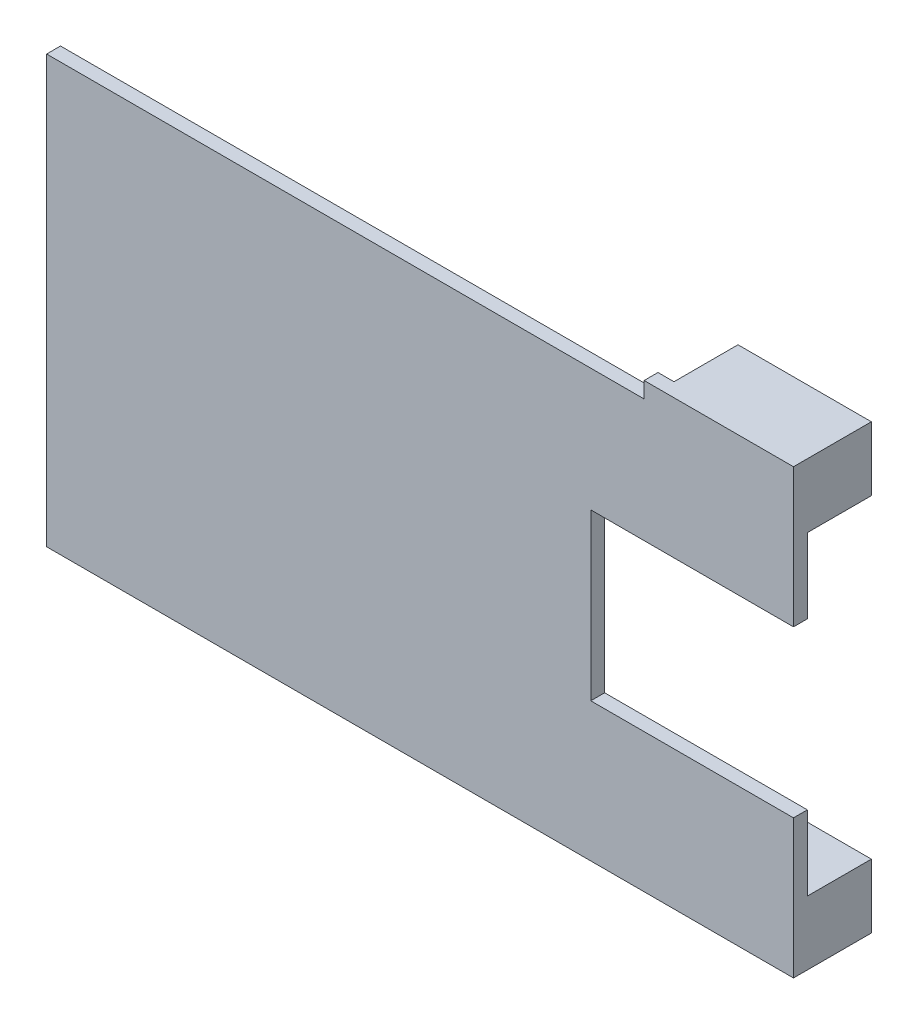
ISO-10303-21;
HEADER;
FILE_DESCRIPTION(('STEP AP214'),'2;1');
FILE_NAME('part.step','',(''),(''),'','','');
FILE_SCHEMA(('AUTOMOTIVE_DESIGN { 1 0 10303 214 1 1 1 1 }'));
ENDSEC;
DATA;
#1=APPLICATION_CONTEXT('core data for automotive mechanical design processes');
#2=APPLICATION_PROTOCOL_DEFINITION('international standard','automotive_design',2000,#1);
#3=PRODUCT_CONTEXT('',#1,'mechanical');
#4=PRODUCT('Part','Part','',(#3));
#5=PRODUCT_RELATED_PRODUCT_CATEGORY('part','',(#4));
#6=PRODUCT_DEFINITION_FORMATION('','',#4);
#7=PRODUCT_DEFINITION_CONTEXT('part definition',#1,'design');
#8=PRODUCT_DEFINITION('design','',#6,#7);
#9=PRODUCT_DEFINITION_SHAPE('','',#8);
#10=(LENGTH_UNIT() NAMED_UNIT(*) SI_UNIT(.MILLI.,.METRE.));
#11=(NAMED_UNIT(*) PLANE_ANGLE_UNIT() SI_UNIT($,.RADIAN.));
#12=(NAMED_UNIT(*) SI_UNIT($,.STERADIAN.) SOLID_ANGLE_UNIT());
#13=UNCERTAINTY_MEASURE_WITH_UNIT(LENGTH_MEASURE(1.E-05),#10,'distance_accuracy_value','');
#14=(GEOMETRIC_REPRESENTATION_CONTEXT(3) GLOBAL_UNCERTAINTY_ASSIGNED_CONTEXT((#13)) GLOBAL_UNIT_ASSIGNED_CONTEXT((#10,
#11,#12)) REPRESENTATION_CONTEXT('',''));
#15=CARTESIAN_POINT('',(0.,0.,0.));
#16=DIRECTION('',(0.,0.,1.));
#17=DIRECTION('',(1.,0.,0.));
#18=AXIS2_PLACEMENT_3D('',#15,#16,#17);
#19=CARTESIAN_POINT('',(70.,0.,1.3));
#20=DIRECTION('',(1.,0.,0.));
#21=DIRECTION('',(0.,0.,-1.));
#22=AXIS2_PLACEMENT_3D('',#19,#20,#21);
#23=PLANE('',#22);
#24=DIRECTION('',(0.,0.,1.));
#25=VECTOR('',#24,1.);
#26=CARTESIAN_POINT('',(70.,13.,-24.5203996704785));
#27=LINE('',#26,#25);
#28=CARTESIAN_POINT('',(70.,13.,0.));
#29=VERTEX_POINT('',#28);
#30=CARTESIAN_POINT('',(70.,13.,1.3));
#31=VERTEX_POINT('',#30);
#32=EDGE_CURVE('E225',#29,#31,#27,.T.);
#33=ORIENTED_EDGE('',*,*,#32,.T.);
#34=DIRECTION('',(0.,-1.,0.));
#35=VECTOR('',#34,1.);
#36=CARTESIAN_POINT('',(70.,0.,1.3));
#37=LINE('',#36,#35);
#38=CARTESIAN_POINT('',(70.,0.,1.3));
#39=VERTEX_POINT('',#38);
#40=EDGE_CURVE('E366',#31,#39,#37,.T.);
#41=ORIENTED_EDGE('',*,*,#40,.T.);
#42=DIRECTION('',(0.,0.,-1.));
#43=VECTOR('',#42,1.);
#44=CARTESIAN_POINT('',(70.,0.,1.3));
#45=LINE('',#44,#43);
#46=CARTESIAN_POINT('',(70.,0.,-6.));
#47=VERTEX_POINT('',#46);
#48=EDGE_CURVE('E369',#39,#47,#45,.T.);
#49=ORIENTED_EDGE('',*,*,#48,.T.);
#50=DIRECTION('',(0.,-1.,0.));
#51=VECTOR('',#50,1.);
#52=CARTESIAN_POINT('',(70.,0.,-6.));
#53=LINE('',#52,#51);
#54=CARTESIAN_POINT('',(70.,6.,-6.));
#55=VERTEX_POINT('',#54);
#56=EDGE_CURVE('E315',#55,#47,#53,.T.);
#57=ORIENTED_EDGE('',*,*,#56,.F.);
#58=DIRECTION('',(0.,0.,1.));
#59=VECTOR('',#58,1.);
#60=CARTESIAN_POINT('',(70.,6.,-6.));
#61=LINE('',#60,#59);
#62=CARTESIAN_POINT('',(70.,6.,0.));
#63=VERTEX_POINT('',#62);
#64=EDGE_CURVE('E325',#55,#63,#61,.T.);
#65=ORIENTED_EDGE('',*,*,#64,.T.);
#66=DIRECTION('',(0.,-1.,0.));
#67=VECTOR('',#66,1.);
#68=CARTESIAN_POINT('',(70.,0.,0.));
#69=LINE('',#68,#67);
#70=EDGE_CURVE('E378',#29,#63,#69,.T.);
#71=ORIENTED_EDGE('',*,*,#70,.F.);
#72=EDGE_LOOP('',(#33,#41,#49,#57,#65,#71));
#73=FACE_BOUND('',#72,.T.);
#74=ADVANCED_FACE('F41',(#73),#23,.T.);
#75=CARTESIAN_POINT('',(0.,0.,-6.));
#76=DIRECTION('',(0.,0.,1.));
#77=DIRECTION('',(1.,0.,0.));
#78=AXIS2_PLACEMENT_3D('',#75,#76,#77);
#79=PLANE('',#78);
#80=ORIENTED_EDGE('',*,*,#56,.T.);
#81=DIRECTION('',(-1.,0.,0.));
#82=VECTOR('',#81,1.);
#83=CARTESIAN_POINT('',(70.,0.,-6.));
#84=LINE('',#83,#82);
#85=CARTESIAN_POINT('',(57.5,0.,-6.));
#86=VERTEX_POINT('',#85);
#87=EDGE_CURVE('E318',#47,#86,#84,.T.);
#88=ORIENTED_EDGE('',*,*,#87,.T.);
#89=DIRECTION('',(0.,1.,0.));
#90=VECTOR('',#89,1.);
#91=CARTESIAN_POINT('',(57.5,0.,-6.));
#92=LINE('',#91,#90);
#93=CARTESIAN_POINT('',(57.5,6.,-6.));
#94=VERTEX_POINT('',#93);
#95=EDGE_CURVE('E321',#86,#94,#92,.T.);
#96=ORIENTED_EDGE('',*,*,#95,.T.);
#97=DIRECTION('',(1.,0.,0.));
#98=VECTOR('',#97,1.);
#99=CARTESIAN_POINT('',(70.,6.,-6.));
#100=LINE('',#99,#98);
#101=EDGE_CURVE('E323',#94,#55,#100,.T.);
#102=ORIENTED_EDGE('',*,*,#101,.T.);
#103=EDGE_LOOP('',(#80,#88,#96,#102));
#104=FACE_BOUND('',#103,.T.);
#105=DIRECTION('',(0.,-1.,0.));
#106=VECTOR('',#105,1.);
#107=CARTESIAN_POINT('',(66.5,4.15,-6.));
#108=LINE('',#107,#106);
#109=CARTESIAN_POINT('',(66.5,4.15,-6.));
#110=VERTEX_POINT('',#109);
#111=CARTESIAN_POINT('',(66.5,1.85,-6.));
#112=VERTEX_POINT('',#111);
#113=EDGE_CURVE('E232',#110,#112,#108,.T.);
#114=ORIENTED_EDGE('',*,*,#113,.F.);
#115=DIRECTION('',(1.,0.,0.));
#116=VECTOR('',#115,1.);
#117=CARTESIAN_POINT('',(66.5,4.15,-6.));
#118=LINE('',#117,#116);
#119=CARTESIAN_POINT('',(65.5,4.15,-6.));
#120=VERTEX_POINT('',#119);
#121=EDGE_CURVE('E238',#120,#110,#118,.T.);
#122=ORIENTED_EDGE('',*,*,#121,.F.);
#123=DIRECTION('',(0.,1.,0.));
#124=VECTOR('',#123,1.);
#125=CARTESIAN_POINT('',(65.5,4.15,-6.));
#126=LINE('',#125,#124);
#127=CARTESIAN_POINT('',(65.5,1.85,-6.));
#128=VERTEX_POINT('',#127);
#129=EDGE_CURVE('E248',#128,#120,#126,.T.);
#130=ORIENTED_EDGE('',*,*,#129,.F.);
#131=DIRECTION('',(-1.,0.,0.));
#132=VECTOR('',#131,1.);
#133=CARTESIAN_POINT('',(66.5,1.85,-6.));
#134=LINE('',#133,#132);
#135=EDGE_CURVE('E64',#112,#128,#134,.T.);
#136=ORIENTED_EDGE('',*,*,#135,.F.);
#137=EDGE_LOOP('',(#114,#122,#130,#136));
#138=FACE_BOUND('',#137,.T.);
#139=ADVANCED_FACE('F431',(#104,#138),#79,.F.);
#140=CARTESIAN_POINT('',(0.,0.,-6.));
#141=DIRECTION('',(0.,0.,-1.));
#142=DIRECTION('',(-1.,0.,0.));
#143=AXIS2_PLACEMENT_3D('',#140,#141,#142);
#144=PLANE('',#143);
#145=DIRECTION('',(0.,-1.,0.));
#146=VECTOR('',#145,1.);
#147=CARTESIAN_POINT('',(70.,41.5,-6.));
#148=LINE('',#147,#146);
#149=CARTESIAN_POINT('',(70.,41.5,-6.));
#150=VERTEX_POINT('',#149);
#151=CARTESIAN_POINT('',(70.,35.5,-6.));
#152=VERTEX_POINT('',#151);
#153=EDGE_CURVE('E293',#150,#152,#148,.T.);
#154=ORIENTED_EDGE('',*,*,#153,.T.);
#155=DIRECTION('',(-1.,0.,0.));
#156=VECTOR('',#155,1.);
#157=CARTESIAN_POINT('',(70.,35.5,-6.));
#158=LINE('',#157,#156);
#159=CARTESIAN_POINT('',(57.5,35.5,-6.));
#160=VERTEX_POINT('',#159);
#161=EDGE_CURVE('E296',#152,#160,#158,.T.);
#162=ORIENTED_EDGE('',*,*,#161,.T.);
#163=DIRECTION('',(0.,1.,0.));
#164=VECTOR('',#163,1.);
#165=CARTESIAN_POINT('',(57.5,41.5,-6.));
#166=LINE('',#165,#164);
#167=CARTESIAN_POINT('',(57.5,41.5,-6.));
#168=VERTEX_POINT('',#167);
#169=EDGE_CURVE('E299',#160,#168,#166,.T.);
#170=ORIENTED_EDGE('',*,*,#169,.T.);
#171=DIRECTION('',(1.,0.,0.));
#172=VECTOR('',#171,1.);
#173=CARTESIAN_POINT('',(70.,41.5,-6.));
#174=LINE('',#173,#172);
#175=EDGE_CURVE('E301',#168,#150,#174,.T.);
#176=ORIENTED_EDGE('',*,*,#175,.T.);
#177=EDGE_LOOP('',(#154,#162,#170,#176));
#178=FACE_BOUND('',#177,.T.);
#179=DIRECTION('',(-1.,0.,0.));
#180=VECTOR('',#179,1.);
#181=CARTESIAN_POINT('',(66.5,37.35,-6.));
#182=LINE('',#181,#180);
#183=CARTESIAN_POINT('',(66.5,37.35,-6.));
#184=VERTEX_POINT('',#183);
#185=CARTESIAN_POINT('',(65.5,37.35,-6.));
#186=VERTEX_POINT('',#185);
#187=EDGE_CURVE('E277',#184,#186,#182,.T.);
#188=ORIENTED_EDGE('',*,*,#187,.F.);
#189=DIRECTION('',(0.,-1.,0.));
#190=VECTOR('',#189,1.);
#191=CARTESIAN_POINT('',(66.5,39.65,-6.));
#192=LINE('',#191,#190);
#193=CARTESIAN_POINT('',(66.5,39.65,-6.));
#194=VERTEX_POINT('',#193);
#195=EDGE_CURVE('E263',#194,#184,#192,.T.);
#196=ORIENTED_EDGE('',*,*,#195,.F.);
#197=DIRECTION('',(1.,0.,0.));
#198=VECTOR('',#197,1.);
#199=CARTESIAN_POINT('',(66.5,39.65,-6.));
#200=LINE('',#199,#198);
#201=CARTESIAN_POINT('',(65.5,39.65,-6.));
#202=VERTEX_POINT('',#201);
#203=EDGE_CURVE('E268',#202,#194,#200,.T.);
#204=ORIENTED_EDGE('',*,*,#203,.F.);
#205=DIRECTION('',(0.,1.,0.));
#206=VECTOR('',#205,1.);
#207=CARTESIAN_POINT('',(65.5,39.65,-6.));
#208=LINE('',#207,#206);
#209=EDGE_CURVE('E279',#186,#202,#208,.T.);
#210=ORIENTED_EDGE('',*,*,#209,.F.);
#211=EDGE_LOOP('',(#188,#196,#204,#210));
#212=FACE_BOUND('',#211,.T.);
#213=ADVANCED_FACE('F454',(#178,#212),#144,.T.);
#214=CARTESIAN_POINT('',(0.,0.,0.));
#215=DIRECTION('',(0.,0.,1.));
#216=DIRECTION('',(1.,0.,0.));
#217=AXIS2_PLACEMENT_3D('',#214,#215,#216);
#218=PLANE('',#217);
#219=DIRECTION('',(0.,1.,0.));
#220=VECTOR('',#219,1.);
#221=CARTESIAN_POINT('',(51.,28.5,0.));
#222=LINE('',#221,#220);
#223=CARTESIAN_POINT('',(51.,13.,0.));
#224=VERTEX_POINT('',#223);
#225=CARTESIAN_POINT('',(51.,28.5,0.));
#226=VERTEX_POINT('',#225);
#227=EDGE_CURVE('E209',#224,#226,#222,.T.);
#228=ORIENTED_EDGE('',*,*,#227,.F.);
#229=DIRECTION('',(-1.,0.,0.));
#230=VECTOR('',#229,1.);
#231=CARTESIAN_POINT('',(51.,13.,0.));
#232=LINE('',#231,#230);
#233=EDGE_CURVE('E233',#29,#224,#232,.T.);
#234=ORIENTED_EDGE('',*,*,#233,.F.);
#235=ORIENTED_EDGE('',*,*,#70,.T.);
#236=DIRECTION('',(1.,0.,0.));
#237=VECTOR('',#236,1.);
#238=CARTESIAN_POINT('',(70.,6.,0.));
#239=LINE('',#238,#237);
#240=CARTESIAN_POINT('',(57.5,6.,0.));
#241=VERTEX_POINT('',#240);
#242=EDGE_CURVE('E319',#241,#63,#239,.T.);
#243=ORIENTED_EDGE('',*,*,#242,.F.);
#244=DIRECTION('',(0.,1.,0.));
#245=VECTOR('',#244,1.);
#246=CARTESIAN_POINT('',(57.5,0.,0.));
#247=LINE('',#246,#245);
#248=CARTESIAN_POINT('',(57.5,0.,0.));
#249=VERTEX_POINT('',#248);
#250=EDGE_CURVE('E314',#249,#241,#247,.T.);
#251=ORIENTED_EDGE('',*,*,#250,.F.);
#252=DIRECTION('',(1.,0.,0.));
#253=VECTOR('',#252,1.);
#254=CARTESIAN_POINT('',(0.,0.,0.));
#255=LINE('',#254,#253);
#256=CARTESIAN_POINT('',(0.,0.,0.));
#257=VERTEX_POINT('',#256);
#258=EDGE_CURVE('E375',#257,#249,#255,.T.);
#259=ORIENTED_EDGE('',*,*,#258,.F.);
#260=DIRECTION('',(0.,1.,0.));
#261=VECTOR('',#260,1.);
#262=CARTESIAN_POINT('',(0.,0.,0.));
#263=LINE('',#262,#261);
#264=CARTESIAN_POINT('',(0.,40.,0.));
#265=VERTEX_POINT('',#264);
#266=EDGE_CURVE('E372',#257,#265,#263,.T.);
#267=ORIENTED_EDGE('',*,*,#266,.T.);
#268=DIRECTION('',(1.,0.,0.));
#269=VECTOR('',#268,1.);
#270=CARTESIAN_POINT('',(0.,40.,0.));
#271=LINE('',#270,#269);
#272=CARTESIAN_POINT('',(56.,40.,0.));
#273=VERTEX_POINT('',#272);
#274=EDGE_CURVE('E356',#265,#273,#271,.T.);
#275=ORIENTED_EDGE('',*,*,#274,.T.);
#276=DIRECTION('',(0.,-1.,0.));
#277=VECTOR('',#276,1.);
#278=CARTESIAN_POINT('',(56.,41.5,0.));
#279=LINE('',#278,#277);
#280=CARTESIAN_POINT('',(56.,41.5,0.));
#281=VERTEX_POINT('',#280);
#282=EDGE_CURVE('E353',#281,#273,#279,.T.);
#283=ORIENTED_EDGE('',*,*,#282,.F.);
#284=DIRECTION('',(-1.,0.,0.));
#285=VECTOR('',#284,1.);
#286=CARTESIAN_POINT('',(70.,41.5,0.));
#287=LINE('',#286,#285);
#288=CARTESIAN_POINT('',(57.5,41.5,0.));
#289=VERTEX_POINT('',#288);
#290=EDGE_CURVE('E341',#289,#281,#287,.T.);
#291=ORIENTED_EDGE('',*,*,#290,.F.);
#292=DIRECTION('',(0.,1.,0.));
#293=VECTOR('',#292,1.);
#294=CARTESIAN_POINT('',(57.5,41.5,0.));
#295=LINE('',#294,#293);
#296=CARTESIAN_POINT('',(57.5,35.5,0.));
#297=VERTEX_POINT('',#296);
#298=EDGE_CURVE('E297',#297,#289,#295,.T.);
#299=ORIENTED_EDGE('',*,*,#298,.F.);
#300=DIRECTION('',(-1.,0.,0.));
#301=VECTOR('',#300,1.);
#302=CARTESIAN_POINT('',(70.,35.5,0.));
#303=LINE('',#302,#301);
#304=CARTESIAN_POINT('',(70.,35.5,0.));
#305=VERTEX_POINT('',#304);
#306=EDGE_CURVE('E292',#305,#297,#303,.T.);
#307=ORIENTED_EDGE('',*,*,#306,.F.);
#308=CARTESIAN_POINT('',(70.,28.5,0.));
#309=VERTEX_POINT('',#308);
#310=EDGE_CURVE('E360',#305,#309,#69,.T.);
#311=ORIENTED_EDGE('',*,*,#310,.T.);
#312=DIRECTION('',(1.,0.,0.));
#313=VECTOR('',#312,1.);
#314=CARTESIAN_POINT('',(70.,28.5,0.));
#315=LINE('',#314,#313);
#316=EDGE_CURVE('E230',#226,#309,#315,.T.);
#317=ORIENTED_EDGE('',*,*,#316,.F.);
#318=EDGE_LOOP('',(#228,#234,#235,#243,#251,#259,#267,#275,#283,#291,#299,#307,#311,#317));
#319=FACE_BOUND('',#318,.T.);
#320=ADVANCED_FACE('F391',(#319),#218,.F.);
#321=CARTESIAN_POINT('',(0.,40.,1.3));
#322=DIRECTION('',(0.,1.,0.));
#323=DIRECTION('',(0.,0.,1.));
#324=AXIS2_PLACEMENT_3D('',#321,#322,#323);
#325=PLANE('',#324);
#326=DIRECTION('',(0.,0.,1.));
#327=VECTOR('',#326,1.);
#328=CARTESIAN_POINT('',(56.,40.,0.));
#329=LINE('',#328,#327);
#330=CARTESIAN_POINT('',(56.,40.,1.3));
#331=VERTEX_POINT('',#330);
#332=EDGE_CURVE('E338',#273,#331,#329,.T.);
#333=ORIENTED_EDGE('',*,*,#332,.F.);
#334=ORIENTED_EDGE('',*,*,#274,.F.);
#335=DIRECTION('',(0.,0.,-1.));
#336=VECTOR('',#335,1.);
#337=CARTESIAN_POINT('',(0.,40.,1.3));
#338=LINE('',#337,#336);
#339=CARTESIAN_POINT('',(0.,40.,1.3));
#340=VERTEX_POINT('',#339);
#341=EDGE_CURVE('E11',#340,#265,#338,.T.);
#342=ORIENTED_EDGE('',*,*,#341,.F.);
#343=DIRECTION('',(1.,0.,0.));
#344=VECTOR('',#343,1.);
#345=CARTESIAN_POINT('',(0.,40.,1.3));
#346=LINE('',#345,#344);
#347=EDGE_CURVE('E357',#340,#331,#346,.T.);
#348=ORIENTED_EDGE('',*,*,#347,.T.);
#349=EDGE_LOOP('',(#333,#334,#342,#348));
#350=FACE_BOUND('',#349,.T.);
#351=ADVANCED_FACE('F43',(#350),#325,.T.);
#352=CARTESIAN_POINT('',(0.,0.,1.3));
#353=DIRECTION('',(-1.,0.,0.));
#354=DIRECTION('',(0.,0.,1.));
#355=AXIS2_PLACEMENT_3D('',#352,#353,#354);
#356=PLANE('',#355);
#357=ORIENTED_EDGE('',*,*,#266,.F.);
#358=DIRECTION('',(0.,0.,-1.));
#359=VECTOR('',#358,1.);
#360=CARTESIAN_POINT('',(0.,0.,1.3));
#361=LINE('',#360,#359);
#362=CARTESIAN_POINT('',(0.,0.,1.3));
#363=VERTEX_POINT('',#362);
#364=EDGE_CURVE('E49',#363,#257,#361,.T.);
#365=ORIENTED_EDGE('',*,*,#364,.F.);
#366=DIRECTION('',(0.,1.,0.));
#367=VECTOR('',#366,1.);
#368=CARTESIAN_POINT('',(0.,0.,1.3));
#369=LINE('',#368,#367);
#370=EDGE_CURVE('E359',#363,#340,#369,.T.);
#371=ORIENTED_EDGE('',*,*,#370,.T.);
#372=ORIENTED_EDGE('',*,*,#341,.T.);
#373=EDGE_LOOP('',(#357,#365,#371,#372));
#374=FACE_BOUND('',#373,.T.);
#375=ADVANCED_FACE('F392',(#374),#356,.T.);
#376=CARTESIAN_POINT('',(0.,0.,1.3));
#377=DIRECTION('',(0.,1.,0.));
#378=DIRECTION('',(0.,0.,1.));
#379=AXIS2_PLACEMENT_3D('',#376,#377,#378);
#380=PLANE('',#379);
#381=ORIENTED_EDGE('',*,*,#258,.T.);
#382=DIRECTION('',(0.,0.,1.));
#383=VECTOR('',#382,1.);
#384=CARTESIAN_POINT('',(57.5,0.,-6.));
#385=LINE('',#384,#383);
#386=EDGE_CURVE('E335',#86,#249,#385,.T.);
#387=ORIENTED_EDGE('',*,*,#386,.F.);
#388=ORIENTED_EDGE('',*,*,#87,.F.);
#389=ORIENTED_EDGE('',*,*,#48,.F.);
#390=DIRECTION('',(1.,0.,0.));
#391=VECTOR('',#390,1.);
#392=CARTESIAN_POINT('',(0.,0.,1.3));
#393=LINE('',#392,#391);
#394=EDGE_CURVE('E363',#363,#39,#393,.T.);
#395=ORIENTED_EDGE('',*,*,#394,.F.);
#396=ORIENTED_EDGE('',*,*,#364,.T.);
#397=EDGE_LOOP('',(#381,#387,#388,#389,#395,#396));
#398=FACE_BOUND('',#397,.T.);
#399=ADVANCED_FACE('F384',(#398),#380,.F.);
#400=DIRECTION('',(0.,0.,1.));
#401=VECTOR('',#400,1.);
#402=CARTESIAN_POINT('',(70.,28.5,-24.5203996704785));
#403=LINE('',#402,#401);
#404=CARTESIAN_POINT('',(70.,28.5,1.3));
#405=VERTEX_POINT('',#404);
#406=EDGE_CURVE('E56',#309,#405,#403,.T.);
#407=ORIENTED_EDGE('',*,*,#406,.F.);
#408=ORIENTED_EDGE('',*,*,#310,.F.);
#409=DIRECTION('',(0.,0.,1.));
#410=VECTOR('',#409,1.);
#411=CARTESIAN_POINT('',(70.,35.5,-6.));
#412=LINE('',#411,#410);
#413=EDGE_CURVE('E312',#152,#305,#412,.T.);
#414=ORIENTED_EDGE('',*,*,#413,.F.);
#415=ORIENTED_EDGE('',*,*,#153,.F.);
#416=DIRECTION('',(0.,0.,-1.));
#417=VECTOR('',#416,1.);
#418=CARTESIAN_POINT('',(70.,41.5,0.));
#419=LINE('',#418,#417);
#420=CARTESIAN_POINT('',(70.,41.5,1.3));
#421=VERTEX_POINT('',#420);
#422=EDGE_CURVE('E339',#421,#150,#419,.T.);
#423=ORIENTED_EDGE('',*,*,#422,.F.);
#424=EDGE_CURVE('E367',#421,#405,#37,.T.);
#425=ORIENTED_EDGE('',*,*,#424,.T.);
#426=EDGE_LOOP('',(#407,#408,#414,#415,#423,#425));
#427=FACE_BOUND('',#426,.T.);
#428=ADVANCED_FACE('F420',(#427),#23,.T.);
#429=CARTESIAN_POINT('',(0.,0.,1.3));
#430=DIRECTION('',(0.,0.,1.));
#431=DIRECTION('',(1.,0.,0.));
#432=AXIS2_PLACEMENT_3D('',#429,#430,#431);
#433=PLANE('',#432);
#434=DIRECTION('',(1.,0.,0.));
#435=VECTOR('',#434,1.);
#436=CARTESIAN_POINT('',(51.,13.,1.3));
#437=LINE('',#436,#435);
#438=CARTESIAN_POINT('',(51.,13.,1.3));
#439=VERTEX_POINT('',#438);
#440=EDGE_CURVE('E220',#439,#31,#437,.T.);
#441=ORIENTED_EDGE('',*,*,#440,.F.);
#442=DIRECTION('',(0.,-1.,0.));
#443=VECTOR('',#442,1.);
#444=CARTESIAN_POINT('',(51.,28.5,1.3));
#445=LINE('',#444,#443);
#446=CARTESIAN_POINT('',(51.,28.5,1.3));
#447=VERTEX_POINT('',#446);
#448=EDGE_CURVE('E206',#447,#439,#445,.T.);
#449=ORIENTED_EDGE('',*,*,#448,.F.);
#450=DIRECTION('',(-1.,0.,0.));
#451=VECTOR('',#450,1.);
#452=CARTESIAN_POINT('',(70.,28.5,1.3));
#453=LINE('',#452,#451);
#454=EDGE_CURVE('E213',#405,#447,#453,.T.);
#455=ORIENTED_EDGE('',*,*,#454,.F.);
#456=ORIENTED_EDGE('',*,*,#424,.F.);
#457=DIRECTION('',(1.,0.,0.));
#458=VECTOR('',#457,1.);
#459=CARTESIAN_POINT('',(70.,41.5,1.3));
#460=LINE('',#459,#458);
#461=CARTESIAN_POINT('',(56.,41.5,1.3));
#462=VERTEX_POINT('',#461);
#463=EDGE_CURVE('E345',#462,#421,#460,.T.);
#464=ORIENTED_EDGE('',*,*,#463,.F.);
#465=DIRECTION('',(0.,-1.,0.));
#466=VECTOR('',#465,1.);
#467=CARTESIAN_POINT('',(56.,41.5,1.3));
#468=LINE('',#467,#466);
#469=EDGE_CURVE('E348',#462,#331,#468,.T.);
#470=ORIENTED_EDGE('',*,*,#469,.T.);
#471=ORIENTED_EDGE('',*,*,#347,.F.);
#472=ORIENTED_EDGE('',*,*,#370,.F.);
#473=ORIENTED_EDGE('',*,*,#394,.T.);
#474=ORIENTED_EDGE('',*,*,#40,.F.);
#475=EDGE_LOOP('',(#441,#449,#455,#456,#464,#470,#471,#472,#473,#474));
#476=FACE_BOUND('',#475,.T.);
#477=ADVANCED_FACE('F218',(#476),#433,.T.);
#478=CARTESIAN_POINT('',(56.,41.5,0.));
#479=DIRECTION('',(1.,0.,0.));
#480=DIRECTION('',(0.,0.,-1.));
#481=AXIS2_PLACEMENT_3D('',#478,#479,#480);
#482=PLANE('',#481);
#483=ORIENTED_EDGE('',*,*,#332,.T.);
#484=ORIENTED_EDGE('',*,*,#469,.F.);
#485=DIRECTION('',(0.,0.,1.));
#486=VECTOR('',#485,1.);
#487=CARTESIAN_POINT('',(56.,41.5,0.));
#488=LINE('',#487,#486);
#489=EDGE_CURVE('E343',#281,#462,#488,.T.);
#490=ORIENTED_EDGE('',*,*,#489,.F.);
#491=ORIENTED_EDGE('',*,*,#282,.T.);
#492=EDGE_LOOP('',(#483,#484,#490,#491));
#493=FACE_BOUND('',#492,.T.);
#494=ADVANCED_FACE('F400',(#493),#482,.F.);
#495=CARTESIAN_POINT('',(0.,41.5,0.));
#496=DIRECTION('',(0.,-1.,0.));
#497=DIRECTION('',(0.,0.,-1.));
#498=AXIS2_PLACEMENT_3D('',#495,#496,#497);
#499=PLANE('',#498);
#500=ORIENTED_EDGE('',*,*,#422,.T.);
#501=ORIENTED_EDGE('',*,*,#175,.F.);
#502=DIRECTION('',(0.,0.,1.));
#503=VECTOR('',#502,1.);
#504=CARTESIAN_POINT('',(57.5,41.5,-6.));
#505=LINE('',#504,#503);
#506=EDGE_CURVE('E304',#168,#289,#505,.T.);
#507=ORIENTED_EDGE('',*,*,#506,.T.);
#508=ORIENTED_EDGE('',*,*,#290,.T.);
#509=ORIENTED_EDGE('',*,*,#489,.T.);
#510=ORIENTED_EDGE('',*,*,#463,.T.);
#511=EDGE_LOOP('',(#500,#501,#507,#508,#509,#510));
#512=FACE_BOUND('',#511,.T.);
#513=ADVANCED_FACE('F404',(#512),#499,.F.);
#514=CARTESIAN_POINT('',(57.5,0.,-6.));
#515=DIRECTION('',(1.,0.,0.));
#516=DIRECTION('',(0.,0.,-1.));
#517=AXIS2_PLACEMENT_3D('',#514,#515,#516);
#518=PLANE('',#517);
#519=ORIENTED_EDGE('',*,*,#250,.T.);
#520=DIRECTION('',(0.,0.,1.));
#521=VECTOR('',#520,1.);
#522=CARTESIAN_POINT('',(57.5,6.,-6.));
#523=LINE('',#522,#521);
#524=EDGE_CURVE('E332',#94,#241,#523,.T.);
#525=ORIENTED_EDGE('',*,*,#524,.F.);
#526=ORIENTED_EDGE('',*,*,#95,.F.);
#527=ORIENTED_EDGE('',*,*,#386,.T.);
#528=EDGE_LOOP('',(#519,#525,#526,#527));
#529=FACE_BOUND('',#528,.T.);
#530=ADVANCED_FACE('F438',(#529),#518,.F.);
#531=CARTESIAN_POINT('',(70.,6.,-6.));
#532=DIRECTION('',(0.,-1.,0.));
#533=DIRECTION('',(0.,0.,-1.));
#534=AXIS2_PLACEMENT_3D('',#531,#532,#533);
#535=PLANE('',#534);
#536=ORIENTED_EDGE('',*,*,#242,.T.);
#537=ORIENTED_EDGE('',*,*,#64,.F.);
#538=ORIENTED_EDGE('',*,*,#101,.F.);
#539=ORIENTED_EDGE('',*,*,#524,.T.);
#540=EDGE_LOOP('',(#536,#537,#538,#539));
#541=FACE_BOUND('',#540,.T.);
#542=ADVANCED_FACE('F436',(#541),#535,.F.);
#543=CARTESIAN_POINT('',(70.,35.5,-6.));
#544=DIRECTION('',(0.,1.,0.));
#545=DIRECTION('',(0.,0.,1.));
#546=AXIS2_PLACEMENT_3D('',#543,#544,#545);
#547=PLANE('',#546);
#548=ORIENTED_EDGE('',*,*,#306,.T.);
#549=DIRECTION('',(0.,0.,1.));
#550=VECTOR('',#549,1.);
#551=CARTESIAN_POINT('',(57.5,35.5,-6.));
#552=LINE('',#551,#550);
#553=EDGE_CURVE('E309',#160,#297,#552,.T.);
#554=ORIENTED_EDGE('',*,*,#553,.F.);
#555=ORIENTED_EDGE('',*,*,#161,.F.);
#556=ORIENTED_EDGE('',*,*,#413,.T.);
#557=EDGE_LOOP('',(#548,#554,#555,#556));
#558=FACE_BOUND('',#557,.T.);
#559=ADVANCED_FACE('F416',(#558),#547,.F.);
#560=CARTESIAN_POINT('',(57.5,41.5,-6.));
#561=DIRECTION('',(1.,0.,0.));
#562=DIRECTION('',(0.,0.,-1.));
#563=AXIS2_PLACEMENT_3D('',#560,#561,#562);
#564=PLANE('',#563);
#565=ORIENTED_EDGE('',*,*,#298,.T.);
#566=ORIENTED_EDGE('',*,*,#506,.F.);
#567=ORIENTED_EDGE('',*,*,#169,.F.);
#568=ORIENTED_EDGE('',*,*,#553,.T.);
#569=EDGE_LOOP('',(#565,#566,#567,#568));
#570=FACE_BOUND('',#569,.T.);
#571=ADVANCED_FACE('F412',(#570),#564,.F.);
#572=CARTESIAN_POINT('',(66.5,39.65,-6.8));
#573=DIRECTION('',(-1.,0.,0.));
#574=DIRECTION('',(0.,0.,1.));
#575=AXIS2_PLACEMENT_3D('',#572,#573,#574);
#576=PLANE('',#575);
#577=ORIENTED_EDGE('',*,*,#195,.T.);
#578=DIRECTION('',(0.,0.,1.));
#579=VECTOR('',#578,1.);
#580=CARTESIAN_POINT('',(66.5,37.35,-6.8));
#581=LINE('',#580,#579);
#582=CARTESIAN_POINT('',(66.5,37.35,-6.8));
#583=VERTEX_POINT('',#582);
#584=EDGE_CURVE('E290',#583,#184,#581,.T.);
#585=ORIENTED_EDGE('',*,*,#584,.F.);
#586=DIRECTION('',(0.,-1.,0.));
#587=VECTOR('',#586,1.);
#588=CARTESIAN_POINT('',(66.5,39.65,-6.8));
#589=LINE('',#588,#587);
#590=CARTESIAN_POINT('',(66.5,39.65,-6.8));
#591=VERTEX_POINT('',#590);
#592=EDGE_CURVE('E264',#591,#583,#589,.T.);
#593=ORIENTED_EDGE('',*,*,#592,.F.);
#594=DIRECTION('',(0.,0.,1.));
#595=VECTOR('',#594,1.);
#596=CARTESIAN_POINT('',(66.5,39.65,-6.8));
#597=LINE('',#596,#595);
#598=EDGE_CURVE('E274',#591,#194,#597,.T.);
#599=ORIENTED_EDGE('',*,*,#598,.T.);
#600=EDGE_LOOP('',(#577,#585,#593,#599));
#601=FACE_BOUND('',#600,.T.);
#602=ADVANCED_FACE('F519',(#601),#576,.F.);
#603=CARTESIAN_POINT('',(66.5,37.35,-6.8));
#604=DIRECTION('',(0.,1.,0.));
#605=DIRECTION('',(0.,0.,1.));
#606=AXIS2_PLACEMENT_3D('',#603,#604,#605);
#607=PLANE('',#606);
#608=ORIENTED_EDGE('',*,*,#187,.T.);
#609=DIRECTION('',(0.,0.,1.));
#610=VECTOR('',#609,1.);
#611=CARTESIAN_POINT('',(65.5,37.35,-6.8));
#612=LINE('',#611,#610);
#613=CARTESIAN_POINT('',(65.5,37.35,-6.8));
#614=VERTEX_POINT('',#613);
#615=EDGE_CURVE('E287',#614,#186,#612,.T.);
#616=ORIENTED_EDGE('',*,*,#615,.F.);
#617=DIRECTION('',(-1.,0.,0.));
#618=VECTOR('',#617,1.);
#619=CARTESIAN_POINT('',(66.5,37.35,-6.8));
#620=LINE('',#619,#618);
#621=EDGE_CURVE('E267',#583,#614,#620,.T.);
#622=ORIENTED_EDGE('',*,*,#621,.F.);
#623=ORIENTED_EDGE('',*,*,#584,.T.);
#624=EDGE_LOOP('',(#608,#616,#622,#623));
#625=FACE_BOUND('',#624,.T.);
#626=ADVANCED_FACE('F540',(#625),#607,.F.);
#627=CARTESIAN_POINT('',(65.5,39.65,-6.8));
#628=DIRECTION('',(1.,0.,0.));
#629=DIRECTION('',(0.,0.,-1.));
#630=AXIS2_PLACEMENT_3D('',#627,#628,#629);
#631=PLANE('',#630);
#632=ORIENTED_EDGE('',*,*,#209,.T.);
#633=DIRECTION('',(0.,0.,1.));
#634=VECTOR('',#633,1.);
#635=CARTESIAN_POINT('',(65.5,39.65,-6.8));
#636=LINE('',#635,#634);
#637=CARTESIAN_POINT('',(65.5,39.65,-6.8));
#638=VERTEX_POINT('',#637);
#639=EDGE_CURVE('E285',#638,#202,#636,.T.);
#640=ORIENTED_EDGE('',*,*,#639,.F.);
#641=DIRECTION('',(0.,1.,0.));
#642=VECTOR('',#641,1.);
#643=CARTESIAN_POINT('',(65.5,39.65,-6.8));
#644=LINE('',#643,#642);
#645=EDGE_CURVE('E270',#614,#638,#644,.T.);
#646=ORIENTED_EDGE('',*,*,#645,.F.);
#647=ORIENTED_EDGE('',*,*,#615,.T.);
#648=EDGE_LOOP('',(#632,#640,#646,#647));
#649=FACE_BOUND('',#648,.T.);
#650=ADVANCED_FACE('F550',(#649),#631,.F.);
#651=CARTESIAN_POINT('',(66.5,39.65,-6.8));
#652=DIRECTION('',(0.,-1.,0.));
#653=DIRECTION('',(0.,0.,-1.));
#654=AXIS2_PLACEMENT_3D('',#651,#652,#653);
#655=PLANE('',#654);
#656=ORIENTED_EDGE('',*,*,#203,.T.);
#657=ORIENTED_EDGE('',*,*,#598,.F.);
#658=DIRECTION('',(1.,0.,0.));
#659=VECTOR('',#658,1.);
#660=CARTESIAN_POINT('',(66.5,39.65,-6.8));
#661=LINE('',#660,#659);
#662=EDGE_CURVE('E272',#638,#591,#661,.T.);
#663=ORIENTED_EDGE('',*,*,#662,.F.);
#664=ORIENTED_EDGE('',*,*,#639,.T.);
#665=EDGE_LOOP('',(#656,#657,#663,#664));
#666=FACE_BOUND('',#665,.T.);
#667=ADVANCED_FACE('F560',(#666),#655,.F.);
#668=CARTESIAN_POINT('',(0.,0.,-6.8));
#669=DIRECTION('',(0.,0.,-1.));
#670=DIRECTION('',(-1.,0.,0.));
#671=AXIS2_PLACEMENT_3D('',#668,#669,#670);
#672=PLANE('',#671);
#673=ORIENTED_EDGE('',*,*,#592,.T.);
#674=ORIENTED_EDGE('',*,*,#621,.T.);
#675=ORIENTED_EDGE('',*,*,#645,.T.);
#676=ORIENTED_EDGE('',*,*,#662,.T.);
#677=EDGE_LOOP('',(#673,#674,#675,#676));
#678=FACE_BOUND('',#677,.T.);
#679=ADVANCED_FACE('F570',(#678),#672,.T.);
#680=CARTESIAN_POINT('',(66.5,4.15,-6.8));
#681=DIRECTION('',(-1.,0.,0.));
#682=DIRECTION('',(0.,0.,1.));
#683=AXIS2_PLACEMENT_3D('',#680,#681,#682);
#684=PLANE('',#683);
#685=ORIENTED_EDGE('',*,*,#113,.T.);
#686=DIRECTION('',(0.,0.,1.));
#687=VECTOR('',#686,1.);
#688=CARTESIAN_POINT('',(66.5,1.85,-6.8));
#689=LINE('',#688,#687);
#690=CARTESIAN_POINT('',(66.5,1.85,-6.8));
#691=VERTEX_POINT('',#690);
#692=EDGE_CURVE('E261',#691,#112,#689,.T.);
#693=ORIENTED_EDGE('',*,*,#692,.F.);
#694=DIRECTION('',(0.,-1.,0.));
#695=VECTOR('',#694,1.);
#696=CARTESIAN_POINT('',(66.5,4.15,-6.8));
#697=LINE('',#696,#695);
#698=CARTESIAN_POINT('',(66.5,4.15,-6.8));
#699=VERTEX_POINT('',#698);
#700=EDGE_CURVE('E234',#699,#691,#697,.T.);
#701=ORIENTED_EDGE('',*,*,#700,.F.);
#702=DIRECTION('',(0.,0.,1.));
#703=VECTOR('',#702,1.);
#704=CARTESIAN_POINT('',(66.5,4.15,-6.8));
#705=LINE('',#704,#703);
#706=EDGE_CURVE('E244',#699,#110,#705,.T.);
#707=ORIENTED_EDGE('',*,*,#706,.T.);
#708=EDGE_LOOP('',(#685,#693,#701,#707));
#709=FACE_BOUND('',#708,.T.);
#710=ADVANCED_FACE('F580',(#709),#684,.F.);
#711=CARTESIAN_POINT('',(66.5,1.85,-6.8));
#712=DIRECTION('',(0.,1.,0.));
#713=DIRECTION('',(0.,0.,1.));
#714=AXIS2_PLACEMENT_3D('',#711,#712,#713);
#715=PLANE('',#714);
#716=ORIENTED_EDGE('',*,*,#135,.T.);
#717=DIRECTION('',(0.,0.,1.));
#718=VECTOR('',#717,1.);
#719=CARTESIAN_POINT('',(65.5,1.85,-6.8));
#720=LINE('',#719,#718);
#721=CARTESIAN_POINT('',(65.5,1.85,-6.8));
#722=VERTEX_POINT('',#721);
#723=EDGE_CURVE('E258',#722,#128,#720,.T.);
#724=ORIENTED_EDGE('',*,*,#723,.F.);
#725=DIRECTION('',(-1.,0.,0.));
#726=VECTOR('',#725,1.);
#727=CARTESIAN_POINT('',(66.5,1.85,-6.8));
#728=LINE('',#727,#726);
#729=EDGE_CURVE('E237',#691,#722,#728,.T.);
#730=ORIENTED_EDGE('',*,*,#729,.F.);
#731=ORIENTED_EDGE('',*,*,#692,.T.);
#732=EDGE_LOOP('',(#716,#724,#730,#731));
#733=FACE_BOUND('',#732,.T.);
#734=ADVANCED_FACE('F590',(#733),#715,.F.);
#735=CARTESIAN_POINT('',(65.5,4.15,-6.8));
#736=DIRECTION('',(1.,0.,0.));
#737=DIRECTION('',(0.,0.,-1.));
#738=AXIS2_PLACEMENT_3D('',#735,#736,#737);
#739=PLANE('',#738);
#740=ORIENTED_EDGE('',*,*,#129,.T.);
#741=DIRECTION('',(0.,0.,1.));
#742=VECTOR('',#741,1.);
#743=CARTESIAN_POINT('',(65.5,4.15,-6.8));
#744=LINE('',#743,#742);
#745=CARTESIAN_POINT('',(65.5,4.15,-6.8));
#746=VERTEX_POINT('',#745);
#747=EDGE_CURVE('E255',#746,#120,#744,.T.);
#748=ORIENTED_EDGE('',*,*,#747,.F.);
#749=DIRECTION('',(0.,1.,0.));
#750=VECTOR('',#749,1.);
#751=CARTESIAN_POINT('',(65.5,4.15,-6.8));
#752=LINE('',#751,#750);
#753=EDGE_CURVE('E240',#722,#746,#752,.T.);
#754=ORIENTED_EDGE('',*,*,#753,.F.);
#755=ORIENTED_EDGE('',*,*,#723,.T.);
#756=EDGE_LOOP('',(#740,#748,#754,#755));
#757=FACE_BOUND('',#756,.T.);
#758=ADVANCED_FACE('F600',(#757),#739,.F.);
#759=CARTESIAN_POINT('',(66.5,4.15,-6.8));
#760=DIRECTION('',(0.,-1.,0.));
#761=DIRECTION('',(0.,0.,-1.));
#762=AXIS2_PLACEMENT_3D('',#759,#760,#761);
#763=PLANE('',#762);
#764=ORIENTED_EDGE('',*,*,#121,.T.);
#765=ORIENTED_EDGE('',*,*,#706,.F.);
#766=DIRECTION('',(1.,0.,0.));
#767=VECTOR('',#766,1.);
#768=CARTESIAN_POINT('',(66.5,4.15,-6.8));
#769=LINE('',#768,#767);
#770=EDGE_CURVE('E242',#746,#699,#769,.T.);
#771=ORIENTED_EDGE('',*,*,#770,.F.);
#772=ORIENTED_EDGE('',*,*,#747,.T.);
#773=EDGE_LOOP('',(#764,#765,#771,#772));
#774=FACE_BOUND('',#773,.T.);
#775=ADVANCED_FACE('F610',(#774),#763,.F.);
#776=CARTESIAN_POINT('',(0.,0.,-6.8));
#777=DIRECTION('',(0.,0.,-1.));
#778=DIRECTION('',(-1.,0.,0.));
#779=AXIS2_PLACEMENT_3D('',#776,#777,#778);
#780=PLANE('',#779);
#781=ORIENTED_EDGE('',*,*,#700,.T.);
#782=ORIENTED_EDGE('',*,*,#729,.T.);
#783=ORIENTED_EDGE('',*,*,#753,.T.);
#784=ORIENTED_EDGE('',*,*,#770,.T.);
#785=EDGE_LOOP('',(#781,#782,#783,#784));
#786=FACE_BOUND('',#785,.T.);
#787=ADVANCED_FACE('F619',(#786),#780,.T.);
#788=CARTESIAN_POINT('',(51.,13.,-24.5203996704785));
#789=DIRECTION('',(0.,-1.,0.));
#790=DIRECTION('',(1.,0.,0.));
#791=AXIS2_PLACEMENT_3D('',#788,#789,#790);
#792=PLANE('',#791);
#793=ORIENTED_EDGE('',*,*,#233,.T.);
#794=DIRECTION('',(0.,0.,1.));
#795=VECTOR('',#794,1.);
#796=CARTESIAN_POINT('',(51.,13.,-24.5203996704785));
#797=LINE('',#796,#795);
#798=EDGE_CURVE('E211',#224,#439,#797,.T.);
#799=ORIENTED_EDGE('',*,*,#798,.T.);
#800=ORIENTED_EDGE('',*,*,#440,.T.);
#801=ORIENTED_EDGE('',*,*,#32,.F.);
#802=EDGE_LOOP('',(#793,#799,#800,#801));
#803=FACE_BOUND('',#802,.T.);
#804=ADVANCED_FACE('F425',(#803),#792,.F.);
#805=CARTESIAN_POINT('',(51.,28.5,-24.5203996704785));
#806=DIRECTION('',(-1.,0.,0.));
#807=DIRECTION('',(0.,0.,1.));
#808=AXIS2_PLACEMENT_3D('',#805,#806,#807);
#809=PLANE('',#808);
#810=ORIENTED_EDGE('',*,*,#227,.T.);
#811=DIRECTION('',(0.,0.,1.));
#812=VECTOR('',#811,1.);
#813=CARTESIAN_POINT('',(51.,28.5,-24.5203996704785));
#814=LINE('',#813,#812);
#815=EDGE_CURVE('E202',#226,#447,#814,.T.);
#816=ORIENTED_EDGE('',*,*,#815,.T.);
#817=ORIENTED_EDGE('',*,*,#448,.T.);
#818=ORIENTED_EDGE('',*,*,#798,.F.);
#819=EDGE_LOOP('',(#810,#816,#817,#818));
#820=FACE_BOUND('',#819,.T.);
#821=ADVANCED_FACE('F203',(#820),#809,.F.);
#822=CARTESIAN_POINT('',(70.,28.5,-24.5203996704785));
#823=DIRECTION('',(0.,1.,0.));
#824=DIRECTION('',(-1.,0.,0.));
#825=AXIS2_PLACEMENT_3D('',#822,#823,#824);
#826=PLANE('',#825);
#827=ORIENTED_EDGE('',*,*,#316,.T.);
#828=ORIENTED_EDGE('',*,*,#406,.T.);
#829=ORIENTED_EDGE('',*,*,#454,.T.);
#830=ORIENTED_EDGE('',*,*,#815,.F.);
#831=EDGE_LOOP('',(#827,#828,#829,#830));
#832=FACE_BOUND('',#831,.T.);
#833=ADVANCED_FACE('F214',(#832),#826,.F.);
#834=CLOSED_SHELL('',(#74,#139,#213,#320,#351,#375,#399,#428,#477,#494,#513,#530,#542,#559,#571,
#602,#626,#650,#667,#679,#710,#734,#758,#775,#787,#804,#821,#833));
#835=MANIFOLD_SOLID_BREP('B2',#834);
#836=ADVANCED_BREP_SHAPE_REPRESENTATION('',(#18,#835),#14);
#837=SHAPE_DEFINITION_REPRESENTATION(#9,#836);
ENDSEC;
END-ISO-10303-21;
